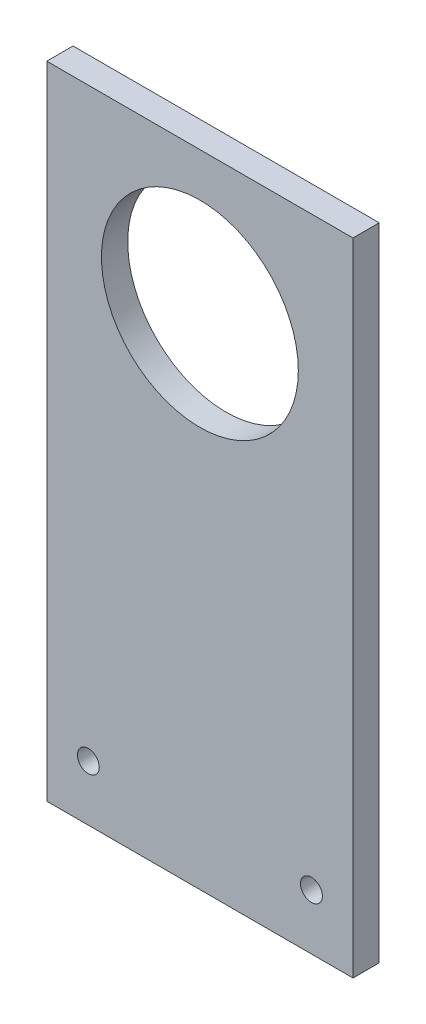
ISO-10303-21;
HEADER;
FILE_DESCRIPTION(('STEP AP214'),'2;1');
FILE_NAME('part.step','',(''),(''),'','','');
FILE_SCHEMA(('AUTOMOTIVE_DESIGN { 1 0 10303 214 1 1 1 1 }'));
ENDSEC;
DATA;
#1=APPLICATION_CONTEXT('core data for automotive mechanical design processes');
#2=APPLICATION_PROTOCOL_DEFINITION('international standard','automotive_design',2000,#1);
#3=PRODUCT_CONTEXT('',#1,'mechanical');
#4=PRODUCT('Part','Part','',(#3));
#5=PRODUCT_RELATED_PRODUCT_CATEGORY('part','',(#4));
#6=PRODUCT_DEFINITION_FORMATION('','',#4);
#7=PRODUCT_DEFINITION_CONTEXT('part definition',#1,'design');
#8=PRODUCT_DEFINITION('design','',#6,#7);
#9=PRODUCT_DEFINITION_SHAPE('','',#8);
#10=(LENGTH_UNIT() NAMED_UNIT(*) SI_UNIT(.MILLI.,.METRE.));
#11=(NAMED_UNIT(*) PLANE_ANGLE_UNIT() SI_UNIT($,.RADIAN.));
#12=(NAMED_UNIT(*) SI_UNIT($,.STERADIAN.) SOLID_ANGLE_UNIT());
#13=UNCERTAINTY_MEASURE_WITH_UNIT(LENGTH_MEASURE(1.E-05),#10,'distance_accuracy_value','');
#14=(GEOMETRIC_REPRESENTATION_CONTEXT(3) GLOBAL_UNCERTAINTY_ASSIGNED_CONTEXT((#13)) GLOBAL_UNIT_ASSIGNED_CONTEXT((#10,
#11,#12)) REPRESENTATION_CONTEXT('',''));
#15=CARTESIAN_POINT('',(0.,0.,0.));
#16=DIRECTION('',(0.,0.,1.));
#17=DIRECTION('',(1.,0.,0.));
#18=AXIS2_PLACEMENT_3D('',#15,#16,#17);
#19=CARTESIAN_POINT('',(0.,0.,3.));
#20=DIRECTION('',(0.,0.,1.));
#21=DIRECTION('',(1.,0.,0.));
#22=AXIS2_PLACEMENT_3D('',#19,#20,#21);
#23=PLANE('',#22);
#24=CARTESIAN_POINT('',(-25.5,12.7,3.));
#25=DIRECTION('',(0.,0.,1.));
#26=DIRECTION('',(1.,0.,0.));
#27=AXIS2_PLACEMENT_3D('',#24,#25,#26);
#28=CIRCLE('',#27,2.49999999999999);
#29=CARTESIAN_POINT('',(-23.,12.7,3.));
#30=VERTEX_POINT('',#29);
#31=EDGE_CURVE('E169',#30,#30,#28,.T.);
#32=ORIENTED_EDGE('',*,*,#31,.F.);
#33=EDGE_LOOP('',(#32));
#34=FACE_BOUND('',#33,.T.);
#35=CARTESIAN_POINT('',(25.5,12.7,3.));
#36=DIRECTION('',(0.,0.,1.));
#37=DIRECTION('',(1.,0.,0.));
#38=AXIS2_PLACEMENT_3D('',#35,#36,#37);
#39=CIRCLE('',#38,2.49999999999999);
#40=CARTESIAN_POINT('',(28.,12.7,3.));
#41=VERTEX_POINT('',#40);
#42=EDGE_CURVE('E171',#41,#41,#39,.T.);
#43=ORIENTED_EDGE('',*,*,#42,.F.);
#44=EDGE_LOOP('',(#43));
#45=FACE_BOUND('',#44,.T.);
#46=DIRECTION('',(0.,-1.,0.));
#47=VECTOR('',#46,1.);
#48=CARTESIAN_POINT('',(-35.,0.,3.));
#49=LINE('',#48,#47);
#50=CARTESIAN_POINT('',(-35.,146.5,3.));
#51=VERTEX_POINT('',#50);
#52=CARTESIAN_POINT('',(-35.,0.,3.));
#53=VERTEX_POINT('',#52);
#54=EDGE_CURVE('E63',#51,#53,#49,.T.);
#55=ORIENTED_EDGE('',*,*,#54,.T.);
#56=DIRECTION('',(1.,0.,0.));
#57=VECTOR('',#56,1.);
#58=CARTESIAN_POINT('',(-35.,0.,3.));
#59=LINE('',#58,#57);
#60=CARTESIAN_POINT('',(35.,0.,3.));
#61=VERTEX_POINT('',#60);
#62=EDGE_CURVE('E93',#53,#61,#59,.T.);
#63=ORIENTED_EDGE('',*,*,#62,.T.);
#64=DIRECTION('',(0.,1.,0.));
#65=VECTOR('',#64,1.);
#66=CARTESIAN_POINT('',(35.,0.,3.));
#67=LINE('',#66,#65);
#68=CARTESIAN_POINT('',(35.,146.5,3.));
#69=VERTEX_POINT('',#68);
#70=EDGE_CURVE('E97',#61,#69,#67,.T.);
#71=ORIENTED_EDGE('',*,*,#70,.T.);
#72=DIRECTION('',(-1.,0.,0.));
#73=VECTOR('',#72,1.);
#74=CARTESIAN_POINT('',(35.,146.5,3.));
#75=LINE('',#74,#73);
#76=EDGE_CURVE('E108',#69,#51,#75,.T.);
#77=ORIENTED_EDGE('',*,*,#76,.T.);
#78=EDGE_LOOP('',(#55,#63,#71,#77));
#79=FACE_BOUND('',#78,.T.);
#80=CARTESIAN_POINT('',(0.,114.,3.));
#81=DIRECTION('',(0.,0.,1.));
#82=DIRECTION('',(1.,0.,0.));
#83=AXIS2_PLACEMENT_3D('',#80,#81,#82);
#84=CIRCLE('',#83,22.5);
#85=CARTESIAN_POINT('',(22.5,114.,3.));
#86=VERTEX_POINT('',#85);
#87=EDGE_CURVE('E117',#86,#86,#84,.T.);
#88=ORIENTED_EDGE('',*,*,#87,.F.);
#89=EDGE_LOOP('',(#88));
#90=FACE_BOUND('',#89,.T.);
#91=ADVANCED_FACE('F45',(#34,#45,#79,#90),#23,.T.);
#92=CARTESIAN_POINT('',(0.,0.,-3.));
#93=DIRECTION('',(0.,0.,1.));
#94=DIRECTION('',(1.,0.,0.));
#95=AXIS2_PLACEMENT_3D('',#92,#93,#94);
#96=PLANE('',#95);
#97=CARTESIAN_POINT('',(-25.5,12.7,-3.));
#98=DIRECTION('',(0.,0.,1.));
#99=DIRECTION('',(1.,0.,0.));
#100=AXIS2_PLACEMENT_3D('',#97,#98,#99);
#101=CIRCLE('',#100,2.49999999999999);
#102=CARTESIAN_POINT('',(-23.,12.7,-3.));
#103=VERTEX_POINT('',#102);
#104=EDGE_CURVE('E167',#103,#103,#101,.T.);
#105=ORIENTED_EDGE('',*,*,#104,.T.);
#106=EDGE_LOOP('',(#105));
#107=FACE_BOUND('',#106,.T.);
#108=CARTESIAN_POINT('',(25.5,12.7,-3.));
#109=DIRECTION('',(0.,0.,1.));
#110=DIRECTION('',(1.,0.,0.));
#111=AXIS2_PLACEMENT_3D('',#108,#109,#110);
#112=CIRCLE('',#111,2.49999999999999);
#113=CARTESIAN_POINT('',(28.,12.7,-3.));
#114=VERTEX_POINT('',#113);
#115=EDGE_CURVE('E178',#114,#114,#112,.T.);
#116=ORIENTED_EDGE('',*,*,#115,.T.);
#117=EDGE_LOOP('',(#116));
#118=FACE_BOUND('',#117,.T.);
#119=DIRECTION('',(1.,0.,0.));
#120=VECTOR('',#119,1.);
#121=CARTESIAN_POINT('',(-35.,0.,-3.));
#122=LINE('',#121,#120);
#123=CARTESIAN_POINT('',(-35.,0.,-3.));
#124=VERTEX_POINT('',#123);
#125=CARTESIAN_POINT('',(35.,0.,-3.));
#126=VERTEX_POINT('',#125);
#127=EDGE_CURVE('E102',#124,#126,#122,.T.);
#128=ORIENTED_EDGE('',*,*,#127,.F.);
#129=DIRECTION('',(0.,-1.,0.));
#130=VECTOR('',#129,1.);
#131=CARTESIAN_POINT('',(-35.,146.5,-3.));
#132=LINE('',#131,#130);
#133=CARTESIAN_POINT('',(-35.,146.5,-3.));
#134=VERTEX_POINT('',#133);
#135=EDGE_CURVE('E122',#134,#124,#132,.T.);
#136=ORIENTED_EDGE('',*,*,#135,.F.);
#137=DIRECTION('',(-1.,0.,0.));
#138=VECTOR('',#137,1.);
#139=CARTESIAN_POINT('',(35.,146.5,-3.));
#140=LINE('',#139,#138);
#141=CARTESIAN_POINT('',(35.,146.5,-3.));
#142=VERTEX_POINT('',#141);
#143=EDGE_CURVE('E87',#142,#134,#140,.T.);
#144=ORIENTED_EDGE('',*,*,#143,.F.);
#145=DIRECTION('',(0.,1.,0.));
#146=VECTOR('',#145,1.);
#147=CARTESIAN_POINT('',(35.,114.,-3.));
#148=LINE('',#147,#146);
#149=EDGE_CURVE('E80',#126,#142,#148,.T.);
#150=ORIENTED_EDGE('',*,*,#149,.F.);
#151=EDGE_LOOP('',(#128,#136,#144,#150));
#152=FACE_BOUND('',#151,.T.);
#153=CARTESIAN_POINT('',(0.,114.,-3.));
#154=DIRECTION('',(0.,0.,1.));
#155=DIRECTION('',(1.,0.,0.));
#156=AXIS2_PLACEMENT_3D('',#153,#154,#155);
#157=CIRCLE('',#156,22.5);
#158=CARTESIAN_POINT('',(22.5,114.,-3.));
#159=VERTEX_POINT('',#158);
#160=EDGE_CURVE('E175',#159,#159,#157,.T.);
#161=ORIENTED_EDGE('',*,*,#160,.T.);
#162=EDGE_LOOP('',(#161));
#163=FACE_BOUND('',#162,.T.);
#164=ADVANCED_FACE('F131',(#107,#118,#152,#163),#96,.F.);
#165=CARTESIAN_POINT('',(-35.,0.,3.));
#166=DIRECTION('',(0.,1.,0.));
#167=DIRECTION('',(-1.,0.,0.));
#168=AXIS2_PLACEMENT_3D('',#165,#166,#167);
#169=PLANE('',#168);
#170=ORIENTED_EDGE('',*,*,#127,.T.);
#171=DIRECTION('',(0.,0.,-1.));
#172=VECTOR('',#171,1.);
#173=CARTESIAN_POINT('',(35.,0.,3.));
#174=LINE('',#173,#172);
#175=EDGE_CURVE('E55',#61,#126,#174,.T.);
#176=ORIENTED_EDGE('',*,*,#175,.F.);
#177=ORIENTED_EDGE('',*,*,#62,.F.);
#178=DIRECTION('',(0.,0.,-1.));
#179=VECTOR('',#178,1.);
#180=CARTESIAN_POINT('',(-35.,0.,3.));
#181=LINE('',#180,#179);
#182=EDGE_CURVE('E11',#53,#124,#181,.T.);
#183=ORIENTED_EDGE('',*,*,#182,.T.);
#184=EDGE_LOOP('',(#170,#176,#177,#183));
#185=FACE_BOUND('',#184,.T.);
#186=ADVANCED_FACE('F47',(#185),#169,.F.);
#187=CARTESIAN_POINT('',(35.,114.,3.));
#188=DIRECTION('',(-1.,0.,0.));
#189=DIRECTION('',(0.,-1.,0.));
#190=AXIS2_PLACEMENT_3D('',#187,#188,#189);
#191=PLANE('',#190);
#192=ORIENTED_EDGE('',*,*,#149,.T.);
#193=DIRECTION('',(0.,0.,-1.));
#194=VECTOR('',#193,1.);
#195=CARTESIAN_POINT('',(35.,146.5,3.));
#196=LINE('',#195,#194);
#197=EDGE_CURVE('E104',#69,#142,#196,.T.);
#198=ORIENTED_EDGE('',*,*,#197,.F.);
#199=ORIENTED_EDGE('',*,*,#70,.F.);
#200=ORIENTED_EDGE('',*,*,#175,.T.);
#201=EDGE_LOOP('',(#192,#198,#199,#200));
#202=FACE_BOUND('',#201,.T.);
#203=ADVANCED_FACE('F105',(#202),#191,.F.);
#204=CARTESIAN_POINT('',(35.,146.5,3.));
#205=DIRECTION('',(0.,-1.,0.));
#206=DIRECTION('',(0.,0.,-1.));
#207=AXIS2_PLACEMENT_3D('',#204,#205,#206);
#208=PLANE('',#207);
#209=ORIENTED_EDGE('',*,*,#143,.T.);
#210=DIRECTION('',(0.,0.,-1.));
#211=VECTOR('',#210,1.);
#212=CARTESIAN_POINT('',(-35.,146.5,3.));
#213=LINE('',#212,#211);
#214=EDGE_CURVE('E111',#51,#134,#213,.T.);
#215=ORIENTED_EDGE('',*,*,#214,.F.);
#216=ORIENTED_EDGE('',*,*,#76,.F.);
#217=ORIENTED_EDGE('',*,*,#197,.T.);
#218=EDGE_LOOP('',(#209,#215,#216,#217));
#219=FACE_BOUND('',#218,.T.);
#220=ADVANCED_FACE('F128',(#219),#208,.F.);
#221=CARTESIAN_POINT('',(-35.,146.5,3.));
#222=DIRECTION('',(1.,0.,0.));
#223=DIRECTION('',(0.,1.,0.));
#224=AXIS2_PLACEMENT_3D('',#221,#222,#223);
#225=PLANE('',#224);
#226=ORIENTED_EDGE('',*,*,#135,.T.);
#227=ORIENTED_EDGE('',*,*,#182,.F.);
#228=ORIENTED_EDGE('',*,*,#54,.F.);
#229=ORIENTED_EDGE('',*,*,#214,.T.);
#230=EDGE_LOOP('',(#226,#227,#228,#229));
#231=FACE_BOUND('',#230,.T.);
#232=ADVANCED_FACE('F133',(#231),#225,.F.);
#233=CARTESIAN_POINT('',(0.,114.,3.));
#234=DIRECTION('',(0.,0.,-1.));
#235=DIRECTION('',(-1.,0.,0.));
#236=AXIS2_PLACEMENT_3D('',#233,#234,#235);
#237=CYLINDRICAL_SURFACE('',#236,22.5);
#238=ORIENTED_EDGE('',*,*,#87,.T.);
#239=EDGE_LOOP('',(#238));
#240=FACE_BOUND('',#239,.T.);
#241=ORIENTED_EDGE('',*,*,#160,.F.);
#242=EDGE_LOOP('',(#241));
#243=FACE_BOUND('',#242,.T.);
#244=ADVANCED_FACE('F135',(#240,#243),#237,.F.);
#245=CARTESIAN_POINT('',(25.5,12.7,-3.));
#246=DIRECTION('',(0.,0.,1.));
#247=DIRECTION('',(1.,0.,0.));
#248=AXIS2_PLACEMENT_3D('',#245,#246,#247);
#249=CYLINDRICAL_SURFACE('',#248,2.49999999999999);
#250=ORIENTED_EDGE('',*,*,#115,.F.);
#251=EDGE_LOOP('',(#250));
#252=FACE_BOUND('',#251,.T.);
#253=ORIENTED_EDGE('',*,*,#42,.T.);
#254=EDGE_LOOP('',(#253));
#255=FACE_BOUND('',#254,.T.);
#256=ADVANCED_FACE('F141',(#252,#255),#249,.F.);
#257=CARTESIAN_POINT('',(-25.5,12.7,-3.));
#258=DIRECTION('',(0.,0.,1.));
#259=DIRECTION('',(1.,0.,0.));
#260=AXIS2_PLACEMENT_3D('',#257,#258,#259);
#261=CYLINDRICAL_SURFACE('',#260,2.49999999999999);
#262=ORIENTED_EDGE('',*,*,#104,.F.);
#263=EDGE_LOOP('',(#262));
#264=FACE_BOUND('',#263,.T.);
#265=ORIENTED_EDGE('',*,*,#31,.T.);
#266=EDGE_LOOP('',(#265));
#267=FACE_BOUND('',#266,.T.);
#268=ADVANCED_FACE('F158',(#264,#267),#261,.F.);
#269=CLOSED_SHELL('',(#91,#164,#186,#203,#220,#232,#244,#256,#268));
#270=MANIFOLD_SOLID_BREP('B2',#269);
#271=ADVANCED_BREP_SHAPE_REPRESENTATION('',(#18,#270),#14);
#272=SHAPE_DEFINITION_REPRESENTATION(#9,#271);
ENDSEC;
END-ISO-10303-21;
